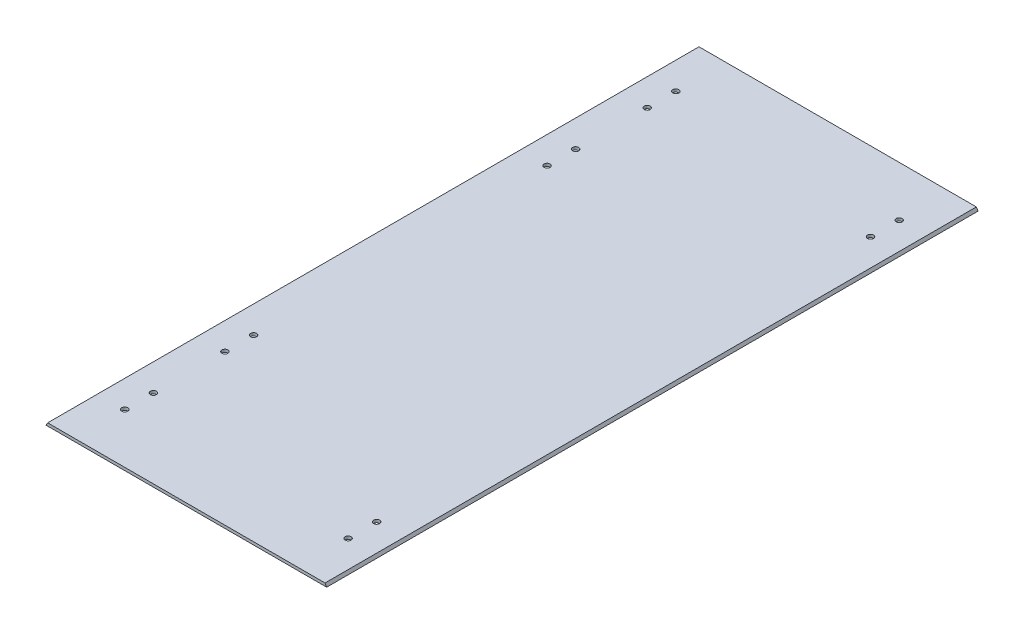
ISO-10303-21;
HEADER;
FILE_DESCRIPTION(('STEP AP214'),'2;1');
FILE_NAME('part.step','',(''),(''),'','','');
FILE_SCHEMA(('AUTOMOTIVE_DESIGN { 1 0 10303 214 1 1 1 1 }'));
ENDSEC;
DATA;
#1=APPLICATION_CONTEXT('core data for automotive mechanical design processes');
#2=APPLICATION_PROTOCOL_DEFINITION('international standard','automotive_design',2000,#1);
#3=PRODUCT_CONTEXT('',#1,'mechanical');
#4=PRODUCT('Part','Part','',(#3));
#5=PRODUCT_RELATED_PRODUCT_CATEGORY('part','',(#4));
#6=PRODUCT_DEFINITION_FORMATION('','',#4);
#7=PRODUCT_DEFINITION_CONTEXT('part definition',#1,'design');
#8=PRODUCT_DEFINITION('design','',#6,#7);
#9=PRODUCT_DEFINITION_SHAPE('','',#8);
#10=(LENGTH_UNIT() NAMED_UNIT(*) SI_UNIT(.MILLI.,.METRE.));
#11=(NAMED_UNIT(*) PLANE_ANGLE_UNIT() SI_UNIT($,.RADIAN.));
#12=(NAMED_UNIT(*) SI_UNIT($,.STERADIAN.) SOLID_ANGLE_UNIT());
#13=UNCERTAINTY_MEASURE_WITH_UNIT(LENGTH_MEASURE(1.E-05),#10,'distance_accuracy_value','');
#14=(GEOMETRIC_REPRESENTATION_CONTEXT(3) GLOBAL_UNCERTAINTY_ASSIGNED_CONTEXT((#13)) GLOBAL_UNIT_ASSIGNED_CONTEXT((#10,
#11,#12)) REPRESENTATION_CONTEXT('',''));
#15=CARTESIAN_POINT('',(0.,0.,0.));
#16=DIRECTION('',(0.,0.,1.));
#17=DIRECTION('',(1.,0.,0.));
#18=AXIS2_PLACEMENT_3D('',#15,#16,#17);
#19=CARTESIAN_POINT('',(-98.,-1.,-455.));
#20=DIRECTION('',(0.,-1.,0.));
#21=DIRECTION('',(0.,0.,-1.));
#22=AXIS2_PLACEMENT_3D('',#19,#20,#21);
#23=PLANE('',#22);
#24=CARTESIAN_POINT('',(78.0000000000001,-1.,-400.));
#25=DIRECTION('',(0.,-1.,0.));
#26=DIRECTION('',(0.,0.,-1.));
#27=AXIS2_PLACEMENT_3D('',#24,#25,#26);
#28=CIRCLE('',#27,2.1);
#29=CARTESIAN_POINT('',(78.0000000000001,-1.,-402.1));
#30=VERTEX_POINT('',#29);
#31=EDGE_CURVE('E222',#30,#30,#28,.T.);
#32=ORIENTED_EDGE('',*,*,#31,.F.);
#33=EDGE_LOOP('',(#32));
#34=FACE_BOUND('',#33,.T.);
#35=CARTESIAN_POINT('',(-78.,-1.,-400.));
#36=DIRECTION('',(0.,-1.,0.));
#37=DIRECTION('',(0.,0.,1.));
#38=AXIS2_PLACEMENT_3D('',#35,#36,#37);
#39=CIRCLE('',#38,2.1);
#40=CARTESIAN_POINT('',(-78.,-1.,-397.9));
#41=VERTEX_POINT('',#40);
#42=EDGE_CURVE('E229',#41,#41,#39,.T.);
#43=ORIENTED_EDGE('',*,*,#42,.F.);
#44=EDGE_LOOP('',(#43));
#45=FACE_BOUND('',#44,.T.);
#46=CARTESIAN_POINT('',(-78.,-1.,-420.));
#47=DIRECTION('',(0.,-1.,0.));
#48=DIRECTION('',(0.,0.,1.));
#49=AXIS2_PLACEMENT_3D('',#46,#47,#48);
#50=CIRCLE('',#49,2.1);
#51=CARTESIAN_POINT('',(-78.,-1.,-417.9));
#52=VERTEX_POINT('',#51);
#53=EDGE_CURVE('E210',#52,#52,#50,.T.);
#54=ORIENTED_EDGE('',*,*,#53,.F.);
#55=EDGE_LOOP('',(#54));
#56=FACE_BOUND('',#55,.T.);
#57=CARTESIAN_POINT('',(-78.,-1.,-105.));
#58=DIRECTION('',(0.,-1.,0.));
#59=DIRECTION('',(0.,0.,-1.));
#60=AXIS2_PLACEMENT_3D('',#57,#58,#59);
#61=CIRCLE('',#60,2.1);
#62=CARTESIAN_POINT('',(-78.,-1.,-107.1));
#63=VERTEX_POINT('',#62);
#64=EDGE_CURVE('E217',#63,#63,#61,.T.);
#65=ORIENTED_EDGE('',*,*,#64,.F.);
#66=EDGE_LOOP('',(#65));
#67=FACE_BOUND('',#66,.T.);
#68=CARTESIAN_POINT('',(-78.,-1.,-55.));
#69=DIRECTION('',(0.,-1.,0.));
#70=DIRECTION('',(0.,0.,-1.));
#71=AXIS2_PLACEMENT_3D('',#68,#69,#70);
#72=CIRCLE('',#71,2.1);
#73=CARTESIAN_POINT('',(-78.,-1.,-57.1));
#74=VERTEX_POINT('',#73);
#75=EDGE_CURVE('E246',#74,#74,#72,.T.);
#76=ORIENTED_EDGE('',*,*,#75,.F.);
#77=EDGE_LOOP('',(#76));
#78=FACE_BOUND('',#77,.T.);
#79=CARTESIAN_POINT('',(78.,-1.,-55.));
#80=DIRECTION('',(0.,-1.,0.));
#81=DIRECTION('',(0.,0.,1.));
#82=AXIS2_PLACEMENT_3D('',#79,#80,#81);
#83=CIRCLE('',#82,2.1);
#84=CARTESIAN_POINT('',(78.,-1.,-52.9));
#85=VERTEX_POINT('',#84);
#86=EDGE_CURVE('E253',#85,#85,#83,.T.);
#87=ORIENTED_EDGE('',*,*,#86,.F.);
#88=EDGE_LOOP('',(#87));
#89=FACE_BOUND('',#88,.T.);
#90=CARTESIAN_POINT('',(78.,-1.,-35.));
#91=DIRECTION('',(0.,-1.,0.));
#92=DIRECTION('',(0.,0.,1.));
#93=AXIS2_PLACEMENT_3D('',#90,#91,#92);
#94=CIRCLE('',#93,2.1);
#95=CARTESIAN_POINT('',(78.,-1.,-32.9));
#96=VERTEX_POINT('',#95);
#97=EDGE_CURVE('E234',#96,#96,#94,.T.);
#98=ORIENTED_EDGE('',*,*,#97,.F.);
#99=EDGE_LOOP('',(#98));
#100=FACE_BOUND('',#99,.T.);
#101=CARTESIAN_POINT('',(78.0000000000001,-1.,-420.));
#102=DIRECTION('',(0.,-1.,0.));
#103=DIRECTION('',(0.,0.,-1.));
#104=AXIS2_PLACEMENT_3D('',#101,#102,#103);
#105=CIRCLE('',#104,2.1);
#106=CARTESIAN_POINT('',(78.0000000000001,-1.,-422.1));
#107=VERTEX_POINT('',#106);
#108=EDGE_CURVE('E241',#107,#107,#105,.T.);
#109=ORIENTED_EDGE('',*,*,#108,.F.);
#110=EDGE_LOOP('',(#109));
#111=FACE_BOUND('',#110,.T.);
#112=CARTESIAN_POINT('',(-78.,-1.,-330.));
#113=DIRECTION('',(0.,-1.,0.));
#114=DIRECTION('',(0.,0.,1.));
#115=AXIS2_PLACEMENT_3D('',#112,#113,#114);
#116=CIRCLE('',#115,2.1);
#117=CARTESIAN_POINT('',(-78.,-1.,-327.9));
#118=VERTEX_POINT('',#117);
#119=EDGE_CURVE('E192',#118,#118,#116,.T.);
#120=ORIENTED_EDGE('',*,*,#119,.F.);
#121=EDGE_LOOP('',(#120));
#122=FACE_BOUND('',#121,.T.);
#123=CARTESIAN_POINT('',(-78.,-1.,-350.));
#124=DIRECTION('',(0.,-1.,0.));
#125=DIRECTION('',(0.,0.,1.));
#126=AXIS2_PLACEMENT_3D('',#123,#124,#125);
#127=CIRCLE('',#126,2.10000000000001);
#128=CARTESIAN_POINT('',(-78.,-1.,-347.9));
#129=VERTEX_POINT('',#128);
#130=EDGE_CURVE('E197',#129,#129,#127,.T.);
#131=ORIENTED_EDGE('',*,*,#130,.F.);
#132=EDGE_LOOP('',(#131));
#133=FACE_BOUND('',#132,.T.);
#134=CARTESIAN_POINT('',(-78.,-1.,-125.));
#135=DIRECTION('',(0.,-1.,0.));
#136=DIRECTION('',(0.,0.,-1.));
#137=AXIS2_PLACEMENT_3D('',#134,#135,#136);
#138=CIRCLE('',#137,2.1);
#139=CARTESIAN_POINT('',(-78.,-1.,-127.1));
#140=VERTEX_POINT('',#139);
#141=EDGE_CURVE('E201',#140,#140,#138,.T.);
#142=ORIENTED_EDGE('',*,*,#141,.F.);
#143=EDGE_LOOP('',(#142));
#144=FACE_BOUND('',#143,.T.);
#145=CARTESIAN_POINT('',(-78.,-1.,-35.));
#146=DIRECTION('',(0.,-1.,0.));
#147=DIRECTION('',(0.,0.,-1.));
#148=AXIS2_PLACEMENT_3D('',#145,#146,#147);
#149=CIRCLE('',#148,2.1);
#150=CARTESIAN_POINT('',(-78.,-1.,-37.1));
#151=VERTEX_POINT('',#150);
#152=EDGE_CURVE('E249',#151,#151,#149,.T.);
#153=ORIENTED_EDGE('',*,*,#152,.F.);
#154=EDGE_LOOP('',(#153));
#155=FACE_BOUND('',#154,.T.);
#156=DIRECTION('',(1.,0.,0.));
#157=VECTOR('',#156,1.);
#158=CARTESIAN_POINT('',(-98.,-1.,0.));
#159=LINE('',#158,#157);
#160=CARTESIAN_POINT('',(-98.,-1.,0.));
#161=VERTEX_POINT('',#160);
#162=CARTESIAN_POINT('',(98.07,-1.,0.));
#163=VERTEX_POINT('',#162);
#164=EDGE_CURVE('E106',#161,#163,#159,.T.);
#165=ORIENTED_EDGE('',*,*,#164,.F.);
#166=DIRECTION('',(0.,0.,1.));
#167=VECTOR('',#166,1.);
#168=CARTESIAN_POINT('',(-98.,-1.,-455.));
#169=LINE('',#168,#167);
#170=CARTESIAN_POINT('',(-98.,-1.,-455.));
#171=VERTEX_POINT('',#170);
#172=EDGE_CURVE('E11',#171,#161,#169,.T.);
#173=ORIENTED_EDGE('',*,*,#172,.F.);
#174=DIRECTION('',(1.,0.,0.));
#175=VECTOR('',#174,1.);
#176=CARTESIAN_POINT('',(-98.,-1.,-455.));
#177=LINE('',#176,#175);
#178=CARTESIAN_POINT('',(98.07,-1.,-455.));
#179=VERTEX_POINT('',#178);
#180=EDGE_CURVE('E99',#171,#179,#177,.T.);
#181=ORIENTED_EDGE('',*,*,#180,.T.);
#182=DIRECTION('',(0.,0.,1.));
#183=VECTOR('',#182,1.);
#184=CARTESIAN_POINT('',(98.07,-1.,-455.));
#185=LINE('',#184,#183);
#186=EDGE_CURVE('E44',#179,#163,#185,.T.);
#187=ORIENTED_EDGE('',*,*,#186,.T.);
#188=EDGE_LOOP('',(#165,#173,#181,#187));
#189=FACE_BOUND('',#188,.T.);
#190=ADVANCED_FACE('F41',(#34,#45,#56,#67,#78,#89,#100,#111,#122,#133,#144,#155,#189),#23,.T.);
#191=CARTESIAN_POINT('',(-98.,-1.,-455.));
#192=DIRECTION('',(-0.866025403784441,0.499999999999996,0.));
#193=DIRECTION('',(-0.499999999999996,-0.866025403784441,0.));
#194=AXIS2_PLACEMENT_3D('',#191,#192,#193);
#195=PLANE('',#194);
#196=DIRECTION('',(-0.499999999999996,-0.866025403784441,0.));
#197=VECTOR('',#196,1.);
#198=CARTESIAN_POINT('',(-98.,-1.,0.));
#199=LINE('',#198,#197);
#200=CARTESIAN_POINT('',(-96.8452994616208,1.,0.));
#201=VERTEX_POINT('',#200);
#202=EDGE_CURVE('E101',#201,#161,#199,.T.);
#203=ORIENTED_EDGE('',*,*,#202,.F.);
#204=DIRECTION('',(0.,0.,1.));
#205=VECTOR('',#204,1.);
#206=CARTESIAN_POINT('',(-96.8452994616208,1.,-455.));
#207=LINE('',#206,#205);
#208=CARTESIAN_POINT('',(-96.8452994616208,1.,-455.));
#209=VERTEX_POINT('',#208);
#210=EDGE_CURVE('E50',#209,#201,#207,.T.);
#211=ORIENTED_EDGE('',*,*,#210,.F.);
#212=DIRECTION('',(-0.499999999999996,-0.866025403784441,0.));
#213=VECTOR('',#212,1.);
#214=CARTESIAN_POINT('',(-98.,-1.,-455.));
#215=LINE('',#214,#213);
#216=EDGE_CURVE('E96',#209,#171,#215,.T.);
#217=ORIENTED_EDGE('',*,*,#216,.T.);
#218=ORIENTED_EDGE('',*,*,#172,.T.);
#219=EDGE_LOOP('',(#203,#211,#217,#218));
#220=FACE_BOUND('',#219,.T.);
#221=ADVANCED_FACE('F117',(#220),#195,.T.);
#222=CARTESIAN_POINT('',(-96.8452994616208,1.,-455.));
#223=DIRECTION('',(0.,1.,0.));
#224=DIRECTION('',(0.,0.,1.));
#225=AXIS2_PLACEMENT_3D('',#222,#223,#224);
#226=PLANE('',#225);
#227=CARTESIAN_POINT('',(78.0000000000001,1.,-400.));
#228=DIRECTION('',(0.,-1.,0.));
#229=DIRECTION('',(0.,0.,-1.));
#230=AXIS2_PLACEMENT_3D('',#227,#228,#229);
#231=CIRCLE('',#230,2.1);
#232=CARTESIAN_POINT('',(78.0000000000001,1.,-402.1));
#233=VERTEX_POINT('',#232);
#234=EDGE_CURVE('E226',#233,#233,#231,.T.);
#235=ORIENTED_EDGE('',*,*,#234,.T.);
#236=EDGE_LOOP('',(#235));
#237=FACE_BOUND('',#236,.T.);
#238=CARTESIAN_POINT('',(-78.,1.,-400.));
#239=DIRECTION('',(0.,-1.,0.));
#240=DIRECTION('',(0.,0.,1.));
#241=AXIS2_PLACEMENT_3D('',#238,#239,#240);
#242=CIRCLE('',#241,2.1);
#243=CARTESIAN_POINT('',(-78.,1.,-397.9));
#244=VERTEX_POINT('',#243);
#245=EDGE_CURVE('E213',#244,#244,#242,.T.);
#246=ORIENTED_EDGE('',*,*,#245,.T.);
#247=EDGE_LOOP('',(#246));
#248=FACE_BOUND('',#247,.T.);
#249=CARTESIAN_POINT('',(-78.,1.,-420.));
#250=DIRECTION('',(0.,-1.,0.));
#251=DIRECTION('',(0.,0.,1.));
#252=AXIS2_PLACEMENT_3D('',#249,#250,#251);
#253=CIRCLE('',#252,2.1);
#254=CARTESIAN_POINT('',(-78.,1.,-417.9));
#255=VERTEX_POINT('',#254);
#256=EDGE_CURVE('E214',#255,#255,#253,.T.);
#257=ORIENTED_EDGE('',*,*,#256,.T.);
#258=EDGE_LOOP('',(#257));
#259=FACE_BOUND('',#258,.T.);
#260=CARTESIAN_POINT('',(-78.,1.,-105.));
#261=DIRECTION('',(0.,-1.,0.));
#262=DIRECTION('',(0.,0.,-1.));
#263=AXIS2_PLACEMENT_3D('',#260,#261,#262);
#264=CIRCLE('',#263,2.1);
#265=CARTESIAN_POINT('',(-78.,1.,-107.1));
#266=VERTEX_POINT('',#265);
#267=EDGE_CURVE('E204',#266,#266,#264,.T.);
#268=ORIENTED_EDGE('',*,*,#267,.T.);
#269=EDGE_LOOP('',(#268));
#270=FACE_BOUND('',#269,.T.);
#271=CARTESIAN_POINT('',(-78.,1.,-55.));
#272=DIRECTION('',(0.,-1.,0.));
#273=DIRECTION('',(0.,0.,-1.));
#274=AXIS2_PLACEMENT_3D('',#271,#272,#273);
#275=CIRCLE('',#274,2.1);
#276=CARTESIAN_POINT('',(-78.,1.,-57.1));
#277=VERTEX_POINT('',#276);
#278=EDGE_CURVE('E250',#277,#277,#275,.T.);
#279=ORIENTED_EDGE('',*,*,#278,.T.);
#280=EDGE_LOOP('',(#279));
#281=FACE_BOUND('',#280,.T.);
#282=CARTESIAN_POINT('',(78.,1.,-55.));
#283=DIRECTION('',(0.,-1.,0.));
#284=DIRECTION('',(0.,0.,1.));
#285=AXIS2_PLACEMENT_3D('',#282,#283,#284);
#286=CIRCLE('',#285,2.1);
#287=CARTESIAN_POINT('',(78.,1.,-52.9));
#288=VERTEX_POINT('',#287);
#289=EDGE_CURVE('E237',#288,#288,#286,.T.);
#290=ORIENTED_EDGE('',*,*,#289,.T.);
#291=EDGE_LOOP('',(#290));
#292=FACE_BOUND('',#291,.T.);
#293=CARTESIAN_POINT('',(78.,1.,-35.));
#294=DIRECTION('',(0.,-1.,0.));
#295=DIRECTION('',(0.,0.,1.));
#296=AXIS2_PLACEMENT_3D('',#293,#294,#295);
#297=CIRCLE('',#296,2.1);
#298=CARTESIAN_POINT('',(78.,1.,-32.9));
#299=VERTEX_POINT('',#298);
#300=EDGE_CURVE('E238',#299,#299,#297,.T.);
#301=ORIENTED_EDGE('',*,*,#300,.T.);
#302=EDGE_LOOP('',(#301));
#303=FACE_BOUND('',#302,.T.);
#304=CARTESIAN_POINT('',(78.0000000000001,1.,-420.));
#305=DIRECTION('',(0.,-1.,0.));
#306=DIRECTION('',(0.,0.,-1.));
#307=AXIS2_PLACEMENT_3D('',#304,#305,#306);
#308=CIRCLE('',#307,2.1);
#309=CARTESIAN_POINT('',(78.0000000000001,1.,-422.1));
#310=VERTEX_POINT('',#309);
#311=EDGE_CURVE('E225',#310,#310,#308,.T.);
#312=ORIENTED_EDGE('',*,*,#311,.T.);
#313=EDGE_LOOP('',(#312));
#314=FACE_BOUND('',#313,.T.);
#315=CARTESIAN_POINT('',(-78.,1.,-330.));
#316=DIRECTION('',(0.,-1.,0.));
#317=DIRECTION('',(0.,0.,1.));
#318=AXIS2_PLACEMENT_3D('',#315,#316,#317);
#319=CIRCLE('',#318,2.1);
#320=CARTESIAN_POINT('',(-78.,1.,-327.9));
#321=VERTEX_POINT('',#320);
#322=EDGE_CURVE('E189',#321,#321,#319,.T.);
#323=ORIENTED_EDGE('',*,*,#322,.T.);
#324=EDGE_LOOP('',(#323));
#325=FACE_BOUND('',#324,.T.);
#326=CARTESIAN_POINT('',(-78.,1.,-350.));
#327=DIRECTION('',(0.,-1.,0.));
#328=DIRECTION('',(0.,0.,1.));
#329=AXIS2_PLACEMENT_3D('',#326,#327,#328);
#330=CIRCLE('',#329,2.10000000000001);
#331=CARTESIAN_POINT('',(-78.,1.,-347.9));
#332=VERTEX_POINT('',#331);
#333=EDGE_CURVE('E194',#332,#332,#330,.T.);
#334=ORIENTED_EDGE('',*,*,#333,.T.);
#335=EDGE_LOOP('',(#334));
#336=FACE_BOUND('',#335,.T.);
#337=CARTESIAN_POINT('',(-78.,1.,-125.));
#338=DIRECTION('',(0.,-1.,0.));
#339=DIRECTION('',(0.,0.,-1.));
#340=AXIS2_PLACEMENT_3D('',#337,#338,#339);
#341=CIRCLE('',#340,2.1);
#342=CARTESIAN_POINT('',(-78.,1.,-127.1));
#343=VERTEX_POINT('',#342);
#344=EDGE_CURVE('E205',#343,#343,#341,.T.);
#345=ORIENTED_EDGE('',*,*,#344,.T.);
#346=EDGE_LOOP('',(#345));
#347=FACE_BOUND('',#346,.T.);
#348=CARTESIAN_POINT('',(-78.,1.,-35.));
#349=DIRECTION('',(0.,-1.,0.));
#350=DIRECTION('',(0.,0.,-1.));
#351=AXIS2_PLACEMENT_3D('',#348,#349,#350);
#352=CIRCLE('',#351,2.1);
#353=CARTESIAN_POINT('',(-78.,1.,-37.1));
#354=VERTEX_POINT('',#353);
#355=EDGE_CURVE('E110',#354,#354,#352,.T.);
#356=ORIENTED_EDGE('',*,*,#355,.T.);
#357=EDGE_LOOP('',(#356));
#358=FACE_BOUND('',#357,.T.);
#359=DIRECTION('',(-1.,0.,0.));
#360=VECTOR('',#359,1.);
#361=CARTESIAN_POINT('',(-96.8452994616208,1.,0.));
#362=LINE('',#361,#360);
#363=CARTESIAN_POINT('',(96.9152994616207,1.,0.));
#364=VERTEX_POINT('',#363);
#365=EDGE_CURVE('E91',#364,#201,#362,.T.);
#366=ORIENTED_EDGE('',*,*,#365,.F.);
#367=DIRECTION('',(0.,0.,1.));
#368=VECTOR('',#367,1.);
#369=CARTESIAN_POINT('',(96.9152994616207,1.,-455.));
#370=LINE('',#369,#368);
#371=CARTESIAN_POINT('',(96.9152994616207,1.,-455.));
#372=VERTEX_POINT('',#371);
#373=EDGE_CURVE('E86',#372,#364,#370,.T.);
#374=ORIENTED_EDGE('',*,*,#373,.F.);
#375=DIRECTION('',(-1.,0.,0.));
#376=VECTOR('',#375,1.);
#377=CARTESIAN_POINT('',(-96.8452994616208,1.,-455.));
#378=LINE('',#377,#376);
#379=EDGE_CURVE('E89',#372,#209,#378,.T.);
#380=ORIENTED_EDGE('',*,*,#379,.T.);
#381=ORIENTED_EDGE('',*,*,#210,.T.);
#382=EDGE_LOOP('',(#366,#374,#380,#381));
#383=FACE_BOUND('',#382,.T.);
#384=ADVANCED_FACE('F88',(#237,#248,#259,#270,#281,#292,#303,#314,#325,#336,#347,#358,#383),
#226,.T.);
#385=CARTESIAN_POINT('',(98.07,-1.,-455.));
#386=DIRECTION('',(0.866025403784441,0.499999999999996,0.));
#387=DIRECTION('',(-0.499999999999996,0.866025403784441,0.));
#388=AXIS2_PLACEMENT_3D('',#385,#386,#387);
#389=PLANE('',#388);
#390=DIRECTION('',(-0.499999999999996,0.866025403784441,0.));
#391=VECTOR('',#390,1.);
#392=CARTESIAN_POINT('',(98.07,-1.,0.));
#393=LINE('',#392,#391);
#394=EDGE_CURVE('E109',#163,#364,#393,.T.);
#395=ORIENTED_EDGE('',*,*,#394,.F.);
#396=ORIENTED_EDGE('',*,*,#186,.F.);
#397=DIRECTION('',(-0.499999999999996,0.866025403784441,0.));
#398=VECTOR('',#397,1.);
#399=CARTESIAN_POINT('',(98.07,-1.,-455.));
#400=LINE('',#399,#398);
#401=EDGE_CURVE('E95',#179,#372,#400,.T.);
#402=ORIENTED_EDGE('',*,*,#401,.T.);
#403=ORIENTED_EDGE('',*,*,#373,.T.);
#404=EDGE_LOOP('',(#395,#396,#402,#403));
#405=FACE_BOUND('',#404,.T.);
#406=ADVANCED_FACE('F98',(#405),#389,.T.);
#407=CARTESIAN_POINT('',(0.,0.,-455.));
#408=DIRECTION('',(0.,0.,1.));
#409=DIRECTION('',(1.,0.,0.));
#410=AXIS2_PLACEMENT_3D('',#407,#408,#409);
#411=PLANE('',#410);
#412=ORIENTED_EDGE('',*,*,#180,.F.);
#413=ORIENTED_EDGE('',*,*,#216,.F.);
#414=ORIENTED_EDGE('',*,*,#379,.F.);
#415=ORIENTED_EDGE('',*,*,#401,.F.);
#416=EDGE_LOOP('',(#412,#413,#414,#415));
#417=FACE_BOUND('',#416,.T.);
#418=ADVANCED_FACE('F94',(#417),#411,.F.);
#419=CARTESIAN_POINT('',(0.,0.,0.));
#420=DIRECTION('',(0.,0.,1.));
#421=DIRECTION('',(1.,0.,0.));
#422=AXIS2_PLACEMENT_3D('',#419,#420,#421);
#423=PLANE('',#422);
#424=ORIENTED_EDGE('',*,*,#164,.T.);
#425=ORIENTED_EDGE('',*,*,#394,.T.);
#426=ORIENTED_EDGE('',*,*,#365,.T.);
#427=ORIENTED_EDGE('',*,*,#202,.T.);
#428=EDGE_LOOP('',(#424,#425,#426,#427));
#429=FACE_BOUND('',#428,.T.);
#430=ADVANCED_FACE('F116',(#429),#423,.T.);
#431=CARTESIAN_POINT('',(-78.,1.,-35.));
#432=DIRECTION('',(0.,-1.,0.));
#433=DIRECTION('',(0.,0.,-1.));
#434=AXIS2_PLACEMENT_3D('',#431,#432,#433);
#435=CYLINDRICAL_SURFACE('',#434,2.1);
#436=ORIENTED_EDGE('',*,*,#355,.F.);
#437=EDGE_LOOP('',(#436));
#438=FACE_BOUND('',#437,.T.);
#439=ORIENTED_EDGE('',*,*,#152,.T.);
#440=EDGE_LOOP('',(#439));
#441=FACE_BOUND('',#440,.T.);
#442=ADVANCED_FACE('F136',(#438,#441),#435,.F.);
#443=CARTESIAN_POINT('',(-78.,1.,-125.));
#444=DIRECTION('',(0.,-1.,0.));
#445=DIRECTION('',(0.,0.,-1.));
#446=AXIS2_PLACEMENT_3D('',#443,#444,#445);
#447=CYLINDRICAL_SURFACE('',#446,2.1);
#448=ORIENTED_EDGE('',*,*,#344,.F.);
#449=EDGE_LOOP('',(#448));
#450=FACE_BOUND('',#449,.T.);
#451=ORIENTED_EDGE('',*,*,#141,.T.);
#452=EDGE_LOOP('',(#451));
#453=FACE_BOUND('',#452,.T.);
#454=ADVANCED_FACE('F140',(#450,#453),#447,.F.);
#455=CARTESIAN_POINT('',(-78.,1.,-350.));
#456=DIRECTION('',(0.,-1.,0.));
#457=DIRECTION('',(0.,0.,-1.));
#458=AXIS2_PLACEMENT_3D('',#455,#456,#457);
#459=CYLINDRICAL_SURFACE('',#458,2.10000000000001);
#460=ORIENTED_EDGE('',*,*,#333,.F.);
#461=EDGE_LOOP('',(#460));
#462=FACE_BOUND('',#461,.T.);
#463=ORIENTED_EDGE('',*,*,#130,.T.);
#464=EDGE_LOOP('',(#463));
#465=FACE_BOUND('',#464,.T.);
#466=ADVANCED_FACE('F175',(#462,#465),#459,.F.);
#467=CARTESIAN_POINT('',(-78.,1.,-330.));
#468=DIRECTION('',(0.,-1.,0.));
#469=DIRECTION('',(0.,0.,-1.));
#470=AXIS2_PLACEMENT_3D('',#467,#468,#469);
#471=CYLINDRICAL_SURFACE('',#470,2.1);
#472=ORIENTED_EDGE('',*,*,#322,.F.);
#473=EDGE_LOOP('',(#472));
#474=FACE_BOUND('',#473,.T.);
#475=ORIENTED_EDGE('',*,*,#119,.T.);
#476=EDGE_LOOP('',(#475));
#477=FACE_BOUND('',#476,.T.);
#478=ADVANCED_FACE('F155',(#474,#477),#471,.F.);
#479=CARTESIAN_POINT('',(78.0000000000001,1.,-420.));
#480=DIRECTION('',(0.,-1.,0.));
#481=DIRECTION('',(0.,0.,-1.));
#482=AXIS2_PLACEMENT_3D('',#479,#480,#481);
#483=CYLINDRICAL_SURFACE('',#482,2.1);
#484=ORIENTED_EDGE('',*,*,#311,.F.);
#485=EDGE_LOOP('',(#484));
#486=FACE_BOUND('',#485,.T.);
#487=ORIENTED_EDGE('',*,*,#108,.T.);
#488=EDGE_LOOP('',(#487));
#489=FACE_BOUND('',#488,.T.);
#490=ADVANCED_FACE('F152',(#486,#489),#483,.F.);
#491=CARTESIAN_POINT('',(78.,1.,-35.));
#492=DIRECTION('',(0.,-1.,0.));
#493=DIRECTION('',(0.,0.,-1.));
#494=AXIS2_PLACEMENT_3D('',#491,#492,#493);
#495=CYLINDRICAL_SURFACE('',#494,2.1);
#496=ORIENTED_EDGE('',*,*,#300,.F.);
#497=EDGE_LOOP('',(#496));
#498=FACE_BOUND('',#497,.T.);
#499=ORIENTED_EDGE('',*,*,#97,.T.);
#500=EDGE_LOOP('',(#499));
#501=FACE_BOUND('',#500,.T.);
#502=ADVANCED_FACE('F146',(#498,#501),#495,.F.);
#503=CARTESIAN_POINT('',(78.,1.,-55.));
#504=DIRECTION('',(0.,-1.,0.));
#505=DIRECTION('',(0.,0.,-1.));
#506=AXIS2_PLACEMENT_3D('',#503,#504,#505);
#507=CYLINDRICAL_SURFACE('',#506,2.1);
#508=ORIENTED_EDGE('',*,*,#289,.F.);
#509=EDGE_LOOP('',(#508));
#510=FACE_BOUND('',#509,.T.);
#511=ORIENTED_EDGE('',*,*,#86,.T.);
#512=EDGE_LOOP('',(#511));
#513=FACE_BOUND('',#512,.T.);
#514=ADVANCED_FACE('F142',(#510,#513),#507,.F.);
#515=CARTESIAN_POINT('',(-78.,1.,-55.));
#516=DIRECTION('',(0.,-1.,0.));
#517=DIRECTION('',(0.,0.,-1.));
#518=AXIS2_PLACEMENT_3D('',#515,#516,#517);
#519=CYLINDRICAL_SURFACE('',#518,2.1);
#520=ORIENTED_EDGE('',*,*,#278,.F.);
#521=EDGE_LOOP('',(#520));
#522=FACE_BOUND('',#521,.T.);
#523=ORIENTED_EDGE('',*,*,#75,.T.);
#524=EDGE_LOOP('',(#523));
#525=FACE_BOUND('',#524,.T.);
#526=ADVANCED_FACE('F145',(#522,#525),#519,.F.);
#527=CARTESIAN_POINT('',(-78.,1.,-105.));
#528=DIRECTION('',(0.,-1.,0.));
#529=DIRECTION('',(0.,0.,-1.));
#530=AXIS2_PLACEMENT_3D('',#527,#528,#529);
#531=CYLINDRICAL_SURFACE('',#530,2.1);
#532=ORIENTED_EDGE('',*,*,#267,.F.);
#533=EDGE_LOOP('',(#532));
#534=FACE_BOUND('',#533,.T.);
#535=ORIENTED_EDGE('',*,*,#64,.T.);
#536=EDGE_LOOP('',(#535));
#537=FACE_BOUND('',#536,.T.);
#538=ADVANCED_FACE('F150',(#534,#537),#531,.F.);
#539=CARTESIAN_POINT('',(-78.,1.,-420.));
#540=DIRECTION('',(0.,-1.,0.));
#541=DIRECTION('',(0.,0.,-1.));
#542=AXIS2_PLACEMENT_3D('',#539,#540,#541);
#543=CYLINDRICAL_SURFACE('',#542,2.1);
#544=ORIENTED_EDGE('',*,*,#256,.F.);
#545=EDGE_LOOP('',(#544));
#546=FACE_BOUND('',#545,.T.);
#547=ORIENTED_EDGE('',*,*,#53,.T.);
#548=EDGE_LOOP('',(#547));
#549=FACE_BOUND('',#548,.T.);
#550=ADVANCED_FACE('F164',(#546,#549),#543,.F.);
#551=CARTESIAN_POINT('',(-78.,1.,-400.));
#552=DIRECTION('',(0.,-1.,0.));
#553=DIRECTION('',(0.,0.,-1.));
#554=AXIS2_PLACEMENT_3D('',#551,#552,#553);
#555=CYLINDRICAL_SURFACE('',#554,2.1);
#556=ORIENTED_EDGE('',*,*,#245,.F.);
#557=EDGE_LOOP('',(#556));
#558=FACE_BOUND('',#557,.T.);
#559=ORIENTED_EDGE('',*,*,#42,.T.);
#560=EDGE_LOOP('',(#559));
#561=FACE_BOUND('',#560,.T.);
#562=ADVANCED_FACE('F160',(#558,#561),#555,.F.);
#563=CARTESIAN_POINT('',(78.0000000000001,1.,-400.));
#564=DIRECTION('',(0.,-1.,0.));
#565=DIRECTION('',(0.,0.,-1.));
#566=AXIS2_PLACEMENT_3D('',#563,#564,#565);
#567=CYLINDRICAL_SURFACE('',#566,2.1);
#568=ORIENTED_EDGE('',*,*,#234,.F.);
#569=EDGE_LOOP('',(#568));
#570=FACE_BOUND('',#569,.T.);
#571=ORIENTED_EDGE('',*,*,#31,.T.);
#572=EDGE_LOOP('',(#571));
#573=FACE_BOUND('',#572,.T.);
#574=ADVANCED_FACE('F163',(#570,#573),#567,.F.);
#575=CLOSED_SHELL('',(#190,#221,#384,#406,#418,#430,#442,#454,#466,#478,#490,#502,#514,#526,
#538,#550,#562,#574));
#576=MANIFOLD_SOLID_BREP('B2',#575);
#577=ADVANCED_BREP_SHAPE_REPRESENTATION('',(#18,#576),#14);
#578=SHAPE_DEFINITION_REPRESENTATION(#9,#577);
ENDSEC;
END-ISO-10303-21;
